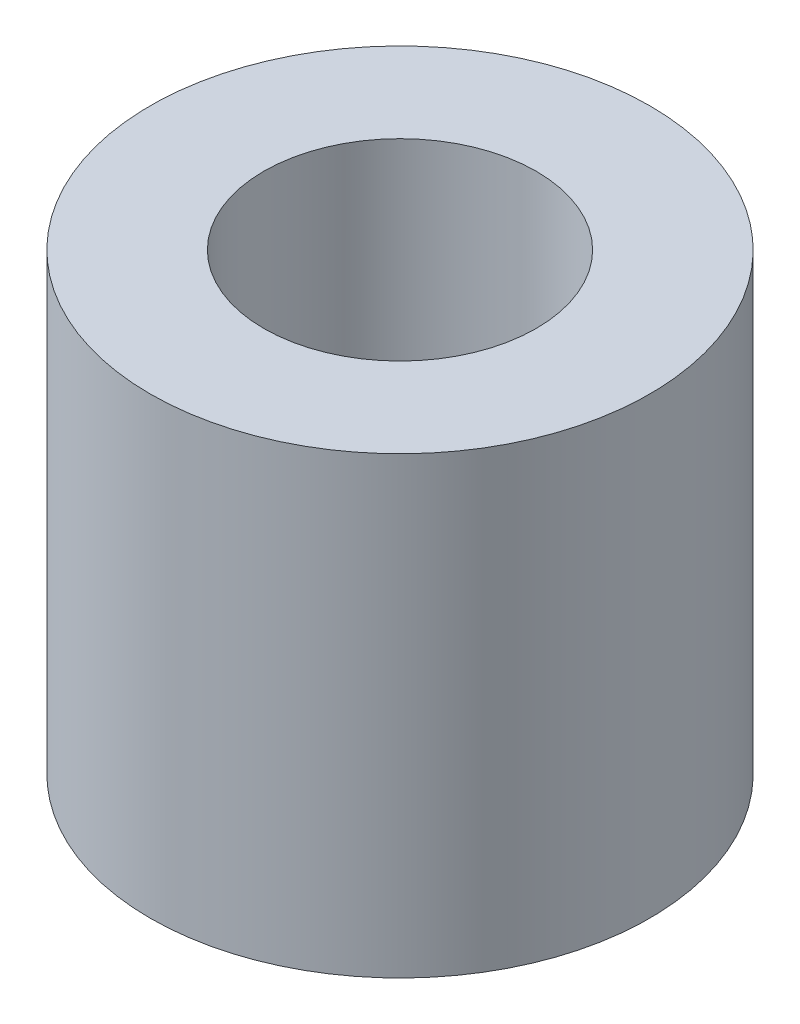
ISO-10303-21;
HEADER;
FILE_DESCRIPTION(('STEP AP214'),'2;1');
FILE_NAME('part.step','',(''),(''),'','','');
FILE_SCHEMA(('AUTOMOTIVE_DESIGN { 1 0 10303 214 1 1 1 1 }'));
ENDSEC;
DATA;
#1=APPLICATION_CONTEXT('core data for automotive mechanical design processes');
#2=APPLICATION_PROTOCOL_DEFINITION('international standard','automotive_design',2000,#1);
#3=PRODUCT_CONTEXT('',#1,'mechanical');
#4=PRODUCT('Part','Part','',(#3));
#5=PRODUCT_RELATED_PRODUCT_CATEGORY('part','',(#4));
#6=PRODUCT_DEFINITION_FORMATION('','',#4);
#7=PRODUCT_DEFINITION_CONTEXT('part definition',#1,'design');
#8=PRODUCT_DEFINITION('design','',#6,#7);
#9=PRODUCT_DEFINITION_SHAPE('','',#8);
#10=(LENGTH_UNIT() NAMED_UNIT(*) SI_UNIT(.MILLI.,.METRE.));
#11=(NAMED_UNIT(*) PLANE_ANGLE_UNIT() SI_UNIT($,.RADIAN.));
#12=(NAMED_UNIT(*) SI_UNIT($,.STERADIAN.) SOLID_ANGLE_UNIT());
#13=UNCERTAINTY_MEASURE_WITH_UNIT(LENGTH_MEASURE(1.E-05),#10,'distance_accuracy_value','');
#14=(GEOMETRIC_REPRESENTATION_CONTEXT(3) GLOBAL_UNCERTAINTY_ASSIGNED_CONTEXT((#13)) GLOBAL_UNIT_ASSIGNED_CONTEXT((#10,
#11,#12)) REPRESENTATION_CONTEXT('',''));
#15=CARTESIAN_POINT('',(0.,0.,0.));
#16=DIRECTION('',(0.,0.,1.));
#17=DIRECTION('',(1.,0.,0.));
#18=AXIS2_PLACEMENT_3D('',#15,#16,#17);
#19=CARTESIAN_POINT('',(0.,5.,0.));
#20=DIRECTION('',(0.,-1.,0.));
#21=DIRECTION('',(0.,0.,-1.));
#22=AXIS2_PLACEMENT_3D('',#19,#20,#21);
#23=CYLINDRICAL_SURFACE('',#22,2.75);
#24=CARTESIAN_POINT('',(0.,5.,0.));
#25=DIRECTION('',(0.,1.,0.));
#26=DIRECTION('',(0.,0.,1.));
#27=AXIS2_PLACEMENT_3D('',#24,#25,#26);
#28=CIRCLE('',#27,2.75);
#29=CARTESIAN_POINT('',(0.,5.,2.75));
#30=VERTEX_POINT('',#29);
#31=EDGE_CURVE('E10',#30,#30,#28,.T.);
#32=ORIENTED_EDGE('',*,*,#31,.F.);
#33=EDGE_LOOP('',(#32));
#34=FACE_BOUND('',#33,.T.);
#35=CARTESIAN_POINT('',(0.,0.,0.));
#36=DIRECTION('',(0.,1.,0.));
#37=DIRECTION('',(0.,0.,1.));
#38=AXIS2_PLACEMENT_3D('',#35,#36,#37);
#39=CIRCLE('',#38,2.75);
#40=CARTESIAN_POINT('',(0.,0.,2.75));
#41=VERTEX_POINT('',#40);
#42=EDGE_CURVE('E57',#41,#41,#39,.T.);
#43=ORIENTED_EDGE('',*,*,#42,.T.);
#44=EDGE_LOOP('',(#43));
#45=FACE_BOUND('',#44,.T.);
#46=ADVANCED_FACE('F50',(#34,#45),#23,.T.);
#47=CARTESIAN_POINT('',(0.,5.,0.));
#48=DIRECTION('',(0.,1.,0.));
#49=DIRECTION('',(0.,0.,1.));
#50=AXIS2_PLACEMENT_3D('',#47,#48,#49);
#51=PLANE('',#50);
#52=CARTESIAN_POINT('',(0.,5.,0.));
#53=DIRECTION('',(0.,1.,0.));
#54=DIRECTION('',(0.,0.,1.));
#55=AXIS2_PLACEMENT_3D('',#52,#53,#54);
#56=CIRCLE('',#55,1.5);
#57=CARTESIAN_POINT('',(0.,5.,1.5));
#58=VERTEX_POINT('',#57);
#59=EDGE_CURVE('E79',#58,#58,#56,.T.);
#60=ORIENTED_EDGE('',*,*,#59,.F.);
#61=EDGE_LOOP('',(#60));
#62=FACE_BOUND('',#61,.T.);
#63=ORIENTED_EDGE('',*,*,#31,.T.);
#64=EDGE_LOOP('',(#63));
#65=FACE_BOUND('',#64,.T.);
#66=ADVANCED_FACE('F85',(#62,#65),#51,.T.);
#67=CARTESIAN_POINT('',(0.,0.,0.));
#68=DIRECTION('',(0.,1.,0.));
#69=DIRECTION('',(0.,0.,1.));
#70=AXIS2_PLACEMENT_3D('',#67,#68,#69);
#71=PLANE('',#70);
#72=CARTESIAN_POINT('',(0.,0.,1.5));
#73=CARTESIAN_POINT('',(0.0247347685201413,0.,1.50000191731977));
#74=CARTESIAN_POINT('',(0.0494707785274392,0.,1.49941047911439));
#75=CARTESIAN_POINT('',(0.098711285107914,0.,1.49702973717077));
#76=CARTESIAN_POINT('',(0.123216190082735,0.,1.49524884881535));
#77=CARTESIAN_POINT('',(0.171994793238844,0.,1.49048966041373));
#78=CARTESIAN_POINT('',(0.196269036682548,0.,1.48751696987769));
#79=CARTESIAN_POINT('',(0.24458604299877,0.,1.4803776814201));
#80=CARTESIAN_POINT('',(0.268629201508579,0.,1.47621376215505));
#81=CARTESIAN_POINT('',(0.316484279183972,0.,1.46669479873131));
#82=CARTESIAN_POINT('',(0.34029614420105,0.,1.46133948234814));
#83=CARTESIAN_POINT('',(0.387689162550758,0.,1.44944085464064));
#84=CARTESIAN_POINT('',(0.411269522479191,0.,1.44289438479575));
#85=CARTESIAN_POINT('',(0.45820019306473,0.,1.4286158629683));
#86=CARTESIAN_POINT('',(0.48154870748097,0.,1.4208779118391));
#87=CARTESIAN_POINT('',(0.528017236187283,0.,1.4042208104248));
#88=CARTESIAN_POINT('',(0.551134233991362,0.,1.3952932559666));
#89=CARTESIAN_POINT('',(0.596863360533465,0.,1.37636715379741));
#90=CARTESIAN_POINT('',(0.619476529112157,0.,1.36637111919517));
#91=CARTESIAN_POINT('',(0.664034064580766,0.,1.34535395524992));
#92=CARTESIAN_POINT('',(0.685981934198623,0.,1.334340260405));
#93=CARTESIAN_POINT('',(0.729210117766866,0.,1.31129212983662));
#94=CARTESIAN_POINT('',(0.750492963164574,0.,1.29926244372853));
#95=CARTESIAN_POINT('',(0.792392002461653,0.,1.27418461850155));
#96=CARTESIAN_POINT('',(0.813009449986701,0.,1.26113857441527));
#97=CARTESIAN_POINT('',(0.853579049090763,0.,1.23403079687989));
#98=CARTESIAN_POINT('',(0.873530892242238,0.,1.21996860186604));
#99=CARTESIAN_POINT('',(0.912770987715104,0.,1.19083115451225));
#100=CARTESIAN_POINT('',(0.932057129929984,0.,1.17575306119582));
#101=CARTESIAN_POINT('',(0.969967308363523,0.,1.14458573744709));
#102=CARTESIAN_POINT('',(0.988587248641817,0.,1.12849152738397));
#103=CARTESIAN_POINT('',(1.02516839349347,0.,1.09529566932262));
#104=CARTESIAN_POINT('',(1.04312341285185,0.,1.07818721107138));
#105=CARTESIAN_POINT('',(1.07814252919732,0.,1.04318750384704));
#106=CARTESIAN_POINT('',(1.09520921716559,0.,1.02529884784119));
#107=CARTESIAN_POINT('',(1.12833220882839,0.,0.988830206366575));
#108=CARTESIAN_POINT('',(1.14439459506974,0.,0.970255750427554));
#109=CARTESIAN_POINT('',(1.17551206025698,0.,0.932419313632704));
#110=CARTESIAN_POINT('',(1.19057129531388,0.,0.913160751866547));
#111=CARTESIAN_POINT('',(1.21968410022328,0.,0.873957802530462));
#112=CARTESIAN_POINT('',(1.23373963003812,0.,0.854014870805388));
#113=CARTESIAN_POINT('',(1.26084735271721,0.,0.813445234315613));
#114=CARTESIAN_POINT('',(1.27389908400013,0.,0.792818221152548));
#115=CARTESIAN_POINT('',(1.29900178729553,0.,0.750882196087141));
#116=CARTESIAN_POINT('',(1.31104972262614,0.,0.729571366964568));
#117=CARTESIAN_POINT('',(1.33414694196362,0.,0.686268917104572));
#118=CARTESIAN_POINT('',(1.3451905361943,0.,0.664274263238161));
#119=CARTESIAN_POINT('',(1.366283602339,0.,0.619606291382987));
#120=CARTESIAN_POINT('',(1.37632475368795,0.,0.596929048519586));
#121=CARTESIAN_POINT('',(1.39528439042208,0.,0.551192299717973));
#122=CARTESIAN_POINT('',(1.40420626184728,0.,0.528134197843492));
#123=CARTESIAN_POINT('',(1.42085197101,0.,0.48176594626997));
#124=CARTESIAN_POINT('',(1.4285835443475,0.,0.45845857750042));
#125=CARTESIAN_POINT('',(1.44285295603568,0.,0.411594129577311));
#126=CARTESIAN_POINT('',(1.44939594256123,0.,0.388038618775887));
#127=CARTESIAN_POINT('',(1.46129034794048,0.,0.340678828161911));
#128=CARTESIAN_POINT('',(1.46664413469096,0.,0.316875143329508));
#129=CARTESIAN_POINT('',(1.47616307710539,0.,0.269020010176691));
#130=CARTESIAN_POINT('',(1.48032768830486,0.,0.244968453572863));
#131=CARTESIAN_POINT('',(1.48747134007842,0.,0.196618229681348));
#132=CARTESIAN_POINT('',(1.49044687970421,0.,0.172319045588923));
#133=CARTESIAN_POINT('',(1.49521479776578,0.,0.123473875281526));
#134=CARTESIAN_POINT('',(1.49700075880558,0.,0.0989272642038461));
#135=CARTESIAN_POINT('',(1.49939451810825,0.,0.0495874722967185));
#136=CARTESIAN_POINT('',(1.49999312718684,0.,0.024793849498333));
#137=CARTESIAN_POINT('',(1.50000685149272,0.,-0.0247169354649043));
#138=CARTESIAN_POINT('',(1.49942563232501,0.,-0.0494340962254271));
#139=CARTESIAN_POINT('',(1.49705990065965,0.,-0.0986428119291011));
#140=CARTESIAN_POINT('',(1.49528359914014,0.,-0.123134757914364));
#141=CARTESIAN_POINT('',(1.49053256875271,0.,-0.171892529595646));
#142=CARTESIAN_POINT('',(1.48756319636057,0.,-0.196158876444453));
#143=CARTESIAN_POINT('',(1.48042838681359,0.,-0.244465409533205));
#144=CARTESIAN_POINT('',(1.47626536499919,0.,-0.268505952238039));
#145=CARTESIAN_POINT('',(1.46674635445583,0.,-0.316361071839167));
#146=CARTESIAN_POINT('',(1.46138982126901,0.,-0.340175540418757));
#147=CARTESIAN_POINT('',(1.44948686529556,0.,-0.387579079844785));
#148=CARTESIAN_POINT('',(1.44293701028185,0.,-0.411167288401632));
#149=CARTESIAN_POINT('',(1.42864975476394,0.,-0.458118944759688));
#150=CARTESIAN_POINT('',(1.42090618623434,0.,-0.481480514027641));
#151=CARTESIAN_POINT('',(1.40423621054064,0.,-0.527980589935181));
#152=CARTESIAN_POINT('',(1.39530114454308,0.,-0.551115988352242));
#153=CARTESIAN_POINT('',(1.37636686701957,0.,-0.596863241282803));
#154=CARTESIAN_POINT('',(1.36637104260847,0.,-0.619476497265175));
#155=CARTESIAN_POINT('',(1.34535403131567,0.,-0.664034096211195));
#156=CARTESIAN_POINT('',(1.33434028074329,0.,-0.685981942655941));
#157=CARTESIAN_POINT('',(1.31129210958854,0.,-0.729210109347193));
#158=CARTESIAN_POINT('',(1.29926243830797,0.,-0.750492960910625));
#159=CARTESIAN_POINT('',(1.2741846239111,0.,-0.792392004711189));
#160=CARTESIAN_POINT('',(1.26113857586517,0.,-0.813009450589703));
#161=CARTESIAN_POINT('',(1.2340307954292,0.,-0.853579048487609));
#162=CARTESIAN_POINT('',(1.21996860147669,0.,-0.873530892080417));
#163=CARTESIAN_POINT('',(1.19083115490263,0.,-0.912770987877514));
#164=CARTESIAN_POINT('',(1.17575306130067,0.,-0.932057129973657));
#165=CARTESIAN_POINT('',(1.14458573734158,0.,-0.969967308319709));
#166=CARTESIAN_POINT('',(1.12849152735558,0.,-0.988587248630059));
#167=CARTESIAN_POINT('',(1.09529566935118,0.,-1.02516839350537));
#168=CARTESIAN_POINT('',(1.07818721107901,0.,-1.04312341285504));
#169=CARTESIAN_POINT('',(1.04318750383942,0.,-1.07814252919415));
#170=CARTESIAN_POINT('',(1.02529884783916,0.,-1.09520921716474));
#171=CARTESIAN_POINT('',(0.988830206368606,0.,-1.12833220882921));
#172=CARTESIAN_POINT('',(0.970255750428107,0.,-1.14439459506996));
#173=CARTESIAN_POINT('',(0.932419313632181,0.,-1.17551206025675));
#174=CARTESIAN_POINT('',(0.913160751866419,0.,-1.1905712953138));
#175=CARTESIAN_POINT('',(0.873957802530625,0.,-1.21968410022332));
#176=CARTESIAN_POINT('',(0.854014870805445,0.,-1.23373963003812));
#177=CARTESIAN_POINT('',(0.813445234315594,0.,-1.26084735271717));
#178=CARTESIAN_POINT('',(0.792818221152557,0.,-1.2738990840001));
#179=CARTESIAN_POINT('',(0.750882196087169,0.,-1.29900178729551));
#180=CARTESIAN_POINT('',(0.729571366964587,0.,-1.31104972262613));
#181=CARTESIAN_POINT('',(0.686268917104581,0.,-1.33414694196361));
#182=CARTESIAN_POINT('',(0.66427426323817,0.,-1.34519053619428));
#183=CARTESIAN_POINT('',(0.619606291382993,0.,-1.366283602339));
#184=CARTESIAN_POINT('',(0.59692904851959,0.,-1.37632475368794));
#185=CARTESIAN_POINT('',(0.551192299717976,0.,-1.39528439042208));
#186=CARTESIAN_POINT('',(0.5281341978435,0.,-1.40420626184728));
#187=CARTESIAN_POINT('',(0.481765946269986,0.,-1.42085197101));
#188=CARTESIAN_POINT('',(0.458458577500438,0.,-1.4285835443475));
#189=CARTESIAN_POINT('',(0.411594129577334,0.,-1.44285295603568));
#190=CARTESIAN_POINT('',(0.388038618775911,0.,-1.44939594256124));
#191=CARTESIAN_POINT('',(0.340678828161938,0.,-1.46129034794048));
#192=CARTESIAN_POINT('',(0.316875143329535,0.,-1.46664413469097));
#193=CARTESIAN_POINT('',(0.269020010176719,0.,-1.47616307710539));
#194=CARTESIAN_POINT('',(0.24496845357289,0.,-1.48032768830486));
#195=CARTESIAN_POINT('',(0.196618229681372,0.,-1.48747134007842));
#196=CARTESIAN_POINT('',(0.172319045588946,0.,-1.49044687970421));
#197=CARTESIAN_POINT('',(0.123473875281544,0.,-1.49521479776578));
#198=CARTESIAN_POINT('',(0.0989272642038614,0.,-1.49700075880558));
#199=CARTESIAN_POINT('',(0.0495874722967268,0.,-1.49939451810825));
#200=CARTESIAN_POINT('',(0.0247938494983373,0.,-1.49999312718684));
#201=CARTESIAN_POINT('',(-0.0247169354648866,0.,-1.50000685149272));
#202=CARTESIAN_POINT('',(-0.0494340962253918,0.,-1.49942563232501));
#203=CARTESIAN_POINT('',(-0.0986428119290357,0.,-1.49705990065965));
#204=CARTESIAN_POINT('',(-0.123134757914286,0.,-1.49528359914014));
#205=CARTESIAN_POINT('',(-0.171892529595547,0.,-1.49053256875271));
#206=CARTESIAN_POINT('',(-0.196158876444348,0.,-1.48756319636057));
#207=CARTESIAN_POINT('',(-0.244465409533089,0.,-1.48042838681359));
#208=CARTESIAN_POINT('',(-0.268505952237921,0.,-1.47626536499919));
#209=CARTESIAN_POINT('',(-0.316361071839049,0.,-1.46674635445583));
#210=CARTESIAN_POINT('',(-0.340175540418641,0.,-1.46138982126901));
#211=CARTESIAN_POINT('',(-0.387579079844679,0.,-1.44948686529556));
#212=CARTESIAN_POINT('',(-0.411167288401534,0.,-1.44293701028185));
#213=CARTESIAN_POINT('',(-0.458118944759609,0.,-1.42864975476394));
#214=CARTESIAN_POINT('',(-0.481480514027575,0.,-1.42090618623434));
#215=CARTESIAN_POINT('',(-0.527980589935146,0.,-1.40423621054064));
#216=CARTESIAN_POINT('',(-0.551115988352224,0.,-1.39530114454308));
#217=CARTESIAN_POINT('',(-0.596863241282783,0.,-1.37636686701959));
#218=CARTESIAN_POINT('',(-0.619476497265135,0.,-1.3663710426085));
#219=CARTESIAN_POINT('',(-0.664034096211121,0.,-1.34535403131573));
#220=CARTESIAN_POINT('',(-0.685981942655852,0.,-1.33434028074336));
#221=CARTESIAN_POINT('',(-0.729210109347081,0.,-1.31129210958863));
#222=CARTESIAN_POINT('',(-0.750492960910505,0.,-1.29926243830807));
#223=CARTESIAN_POINT('',(-0.792392004711057,0.,-1.2741846239112));
#224=CARTESIAN_POINT('',(-0.813009450589568,0.,-1.26113857586528));
#225=CARTESIAN_POINT('',(-0.853579048487474,0.,-1.2340307954293));
#226=CARTESIAN_POINT('',(-0.873530892080284,0.,-1.21996860147679));
#227=CARTESIAN_POINT('',(-0.912770987877394,0.,-1.19083115490272));
#228=CARTESIAN_POINT('',(-0.932057129973545,0.,-1.17575306130075));
#229=CARTESIAN_POINT('',(-0.969967308319619,0.,-1.14458573734165));
#230=CARTESIAN_POINT('',(-0.988587248629984,0.,-1.12849152735564));
#231=CARTESIAN_POINT('',(-1.02516839350533,0.,-1.09529566935121));
#232=CARTESIAN_POINT('',(-1.04312341285502,0.,-1.07818721107903));
#233=CARTESIAN_POINT('',(-1.07814252919416,0.,-1.04318750383942));
#234=CARTESIAN_POINT('',(-1.09520921716476,0.,-1.02529884783915));
#235=CARTESIAN_POINT('',(-1.12833220882925,0.,-0.988830206368587));
#236=CARTESIAN_POINT('',(-1.14439459507,0.,-0.970255750428083));
#237=CARTESIAN_POINT('',(-1.1755120602568,0.,-0.932419313632152));
#238=CARTESIAN_POINT('',(-1.19057129531386,0.,-0.913160751866387));
#239=CARTESIAN_POINT('',(-1.21968410022339,0.,-0.873957802530589));
#240=CARTESIAN_POINT('',(-1.23373963003819,0.,-0.854014870805409));
#241=CARTESIAN_POINT('',(-1.26084735271724,0.,-0.813445234315558));
#242=CARTESIAN_POINT('',(-1.27389908400017,0.,-0.792818221152521));
#243=CARTESIAN_POINT('',(-1.29900178729558,0.,-0.750882196087137));
#244=CARTESIAN_POINT('',(-1.31104972262618,0.,-0.729571366964557));
#245=CARTESIAN_POINT('',(-1.33414694196365,0.,-0.686268917104558));
#246=CARTESIAN_POINT('',(-1.34519053619432,0.,-0.664274263238151));
#247=CARTESIAN_POINT('',(-1.36628360233902,0.,-0.619606291382983));
#248=CARTESIAN_POINT('',(-1.37632475368795,0.,-0.596929048519585));
#249=CARTESIAN_POINT('',(-1.39528439042208,0.,-0.551192299717958));
#250=CARTESIAN_POINT('',(-1.40420626184728,0.,-0.528134197843463));
#251=CARTESIAN_POINT('',(-1.42085197101,0.,-0.481765946269916));
#252=CARTESIAN_POINT('',(-1.42858354434749,0.,-0.458458577500356));
#253=CARTESIAN_POINT('',(-1.44285295603568,0.,-0.41159412957723));
#254=CARTESIAN_POINT('',(-1.44939594256123,0.,-0.3880386187758));
#255=CARTESIAN_POINT('',(-1.46129034794048,0.,-0.340678828161815));
#256=CARTESIAN_POINT('',(-1.46664413469096,0.,-0.31687514332941));
#257=CARTESIAN_POINT('',(-1.47616307710539,0.,-0.269020010176593));
#258=CARTESIAN_POINT('',(-1.48032768830486,0.,-0.244968453572767));
#259=CARTESIAN_POINT('',(-1.48747134007842,0.,-0.196618229681261));
#260=CARTESIAN_POINT('',(-1.49044687970421,0.,-0.172319045588842));
#261=CARTESIAN_POINT('',(-1.49521479776578,0.,-0.123473875281462));
#262=CARTESIAN_POINT('',(-1.49700075880558,0.,-0.0989272642037922));
#263=CARTESIAN_POINT('',(-1.49939451810825,0.,-0.0495874722966896));
#264=CARTESIAN_POINT('',(-1.49999312718684,0.,-0.0247938494983187));
#265=CARTESIAN_POINT('',(-1.50000685149272,0.,0.0247169354648974));
#266=CARTESIAN_POINT('',(-1.49942563232501,0.,0.0494340962254135));
#267=CARTESIAN_POINT('',(-1.49705990065965,0.,0.0986428119290759));
#268=CARTESIAN_POINT('',(-1.49528359914014,0.,0.123134757914334));
#269=CARTESIAN_POINT('',(-1.49053256875271,0.,0.171892529595608));
#270=CARTESIAN_POINT('',(-1.48756319636057,0.,0.196158876444413));
#271=CARTESIAN_POINT('',(-1.48042838681359,0.,0.24446540953316));
#272=CARTESIAN_POINT('',(-1.47626536499919,0.,0.268505952237994));
#273=CARTESIAN_POINT('',(-1.46674635445583,0.,0.316361071839122));
#274=CARTESIAN_POINT('',(-1.46138982126901,0.,0.340175540418712));
#275=CARTESIAN_POINT('',(-1.44948686529556,0.,0.387579079844745));
#276=CARTESIAN_POINT('',(-1.44293701028185,0.,0.411167288401595));
#277=CARTESIAN_POINT('',(-1.42864975476394,0.,0.458118944759658));
#278=CARTESIAN_POINT('',(-1.42090618623434,0.,0.481480514027616));
#279=CARTESIAN_POINT('',(-1.40423621054064,0.,0.527980589935168));
#280=CARTESIAN_POINT('',(-1.39530114454308,0.,0.551115988352235));
#281=CARTESIAN_POINT('',(-1.37636686701957,0.,0.596863241282799));
#282=CARTESIAN_POINT('',(-1.36637104260847,0.,0.619476497265167));
#283=CARTESIAN_POINT('',(-1.34535403131569,0.,0.664034096211177));
#284=CARTESIAN_POINT('',(-1.33434028074331,0.,0.685981942655918));
#285=CARTESIAN_POINT('',(-1.31129210958857,0.,0.72921010934717));
#286=CARTESIAN_POINT('',(-1.29926243830801,0.,0.750492960910608));
#287=CARTESIAN_POINT('',(-1.27418462391113,0.,0.792392004711148));
#288=CARTESIAN_POINT('',(-1.26113857586519,0.,0.813009450589632));
#289=CARTESIAN_POINT('',(-1.23403079542924,0.,0.853579048487616));
#290=CARTESIAN_POINT('',(-1.21996860147678,0.,0.87353089208053));
#291=CARTESIAN_POINT('',(-1.1908311549026,0.,0.91277098787734));
#292=CARTESIAN_POINT('',(-1.17575306130047,0.,0.932057129973087));
#293=CARTESIAN_POINT('',(-1.14458573734183,0.,0.969967308320233));
#294=CARTESIAN_POINT('',(-1.12849152735645,0.,0.988587248632084));
#295=CARTESIAN_POINT('',(-1.09529566935033,0.,1.0251683935033));
#296=CARTESIAN_POINT('',(-1.0781872110758,0.,1.04312341284732));
#297=CARTESIAN_POINT('',(-1.04318750384262,0.,1.07814252920184));
#298=CARTESIAN_POINT('',(-1.02529884785109,0.,1.0952092171934));
#299=CARTESIAN_POINT('',(-0.988830206356722,0.,1.12833220880078));
#300=CARTESIAN_POINT('',(-0.970255750383947,0.,1.14439459496413));
#301=CARTESIAN_POINT('',(-0.932419313676091,0.,1.17551206036216));
#302=CARTESIAN_POINT('',(-0.913160752029996,0.,1.19057129570623));
#303=CARTESIAN_POINT('',(-0.873957802367308,0.,1.21968409983174));
#304=CARTESIAN_POINT('',(-0.854014870196705,0.,1.23373962857825));
#305=CARTESIAN_POINT('',(-0.813445234924539,0.,1.26084735417778));
#306=CARTESIAN_POINT('',(-0.792818223425575,0.,1.27389908945181));
#307=CARTESIAN_POINT('',(-0.750882193807439,0.,1.29900178182794));
#308=CARTESIAN_POINT('',(-0.729571358444985,0.,1.3110497021929));
#309=CARTESIAN_POINT('',(-0.686268925669725,0.,1.33414696250625));
#310=CARTESIAN_POINT('',(-0.664274295286334,0.,1.34519061305836));
#311=CARTESIAN_POINT('',(-0.619606259087724,0.,1.36628352488237));
#312=CARTESIAN_POINT('',(-0.596928927538332,0.,1.37632446352769));
#313=CARTESIAN_POINT('',(-0.551174025918387,0.,1.39529230514219));
#314=CARTESIAN_POINT('',(-0.528097495867619,0.,1.40422171623575));
#315=CARTESIAN_POINT('',(-0.481697648144694,0.,1.42088034614802));
#316=CARTESIAN_POINT('',(-0.45837720430135,0.,1.42861755810062));
#317=CARTESIAN_POINT('',(-0.411491739369845,0.,1.4428957315904));
#318=CARTESIAN_POINT('',(-0.387928369299279,0.,1.44944211148131));
#319=CARTESIAN_POINT('',(-0.340558037167847,0.,1.46134087072968));
#320=CARTESIAN_POINT('',(-0.316751739183575,0.,1.4666958924649));
#321=CARTESIAN_POINT('',(-0.268896578889262,0.,1.47621484357386));
#322=CARTESIAN_POINT('',(-0.244847662433289,0.,1.48037850069419));
#323=CARTESIAN_POINT('',(-0.19650787183171,0.,1.48751780205908));
#324=CARTESIAN_POINT('',(-0.172216519719711,0.,1.49049020834572));
#325=CARTESIAN_POINT('',(-0.123392423045567,0.,1.49524939885631));
#326=CARTESIAN_POINT('',(-0.0988590794768771,0.,1.49703001297542));
#327=CARTESIAN_POINT('',(-0.0495503373854331,0.,1.49941074318796));
#328=CARTESIAN_POINT('',(-0.0247745043790469,0.,1.50000189650473));
#329=CARTESIAN_POINT('',(0.,0.,1.5));
#330=B_SPLINE_CURVE_WITH_KNOTS('',3,(#72,#73,#74,#75,#76,#77,#78,#79,#80,#81,#82,#83,#84,#85,
#86,#87,#88,#89,#90,#91,#92,#93,#94,#95,#96,#97,#98,#99,#100,#101,#102,#103,#104,#105,#106,#107,
#108,#109,#110,#111,#112,#113,#114,#115,#116,#117,#118,#119,#120,#121,#122,#123,#124,#125,#126,
#127,#128,#129,#130,#131,#132,#133,#134,#135,#136,#137,#138,#139,#140,#141,#142,#143,#144,#145,
#146,#147,#148,#149,#150,#151,#152,#153,#154,#155,#156,#157,#158,#159,#160,#161,#162,#163,#164,
#165,#166,#167,#168,#169,#170,#171,#172,#173,#174,#175,#176,#177,#178,#179,#180,#181,#182,#183,
#184,#185,#186,#187,#188,#189,#190,#191,#192,#193,#194,#195,#196,#197,#198,#199,#200,#201,#202,
#203,#204,#205,#206,#207,#208,#209,#210,#211,#212,#213,#214,#215,#216,#217,#218,#219,#220,#221,
#222,#223,#224,#225,#226,#227,#228,#229,#230,#231,#232,#233,#234,#235,#236,#237,#238,#239,#240,
#241,#242,#243,#244,#245,#246,#247,#248,#249,#250,#251,#252,#253,#254,#255,#256,#257,#258,#259,
#260,#261,#262,#263,#264,#265,#266,#267,#268,#269,#270,#271,#272,#273,#274,#275,#276,#277,#278,
#279,#280,#281,#282,#283,#284,#285,#286,#287,#288,#289,#290,#291,#292,#293,#294,#295,#296,#297,
#298,#299,#300,#301,#302,#303,#304,#305,#306,#307,#308,#309,#310,#311,#312,#313,#314,#315,#316,
#317,#318,#319,#320,#321,#322,#323,#324,#325,#326,#327,#328,#329),.UNSPECIFIED.,.F.,.F.,(4,2,2,
2,2,2,2,2,2,2,2,2,2,2,2,2,2,2,2,2,2,2,2,2,2,2,2,2,2,2,2,2,2,2,2,2,2,2,2,2,2,2,2,2,2,2,2,2,2,2,2,
2,2,2,2,2,2,2,2,2,2,2,2,2,2,2,2,2,2,2,2,2,2,2,2,2,2,2,2,2,2,2,2,2,2,2,2,2,2,2,2,2,2,2,2,2,2,2,2,
2,2,2,2,2,2,2,2,2,2,2,2,2,2,2,2,2,2,2,2,2,2,2,2,2,2,2,2,2,4),(0.,0.0741989708048554,
0.147878466158453,0.221215167441637,0.294388239176489,0.367578047562669,0.440964835396546,
0.51472740149901,0.589041832398688,0.663185166528956,0.736824221437525,0.810136292194152,
0.883301050981045,0.95649925476356,1.02991141346054,1.10371646715634,1.17809052013483,
1.2522338542651,1.32587290917367,1.39918497993029,1.47234973871718,1.5455479424997,
1.61896010119669,1.69276515489248,1.76713920787097,1.84128254200127,1.91492159690986,
1.9882336676665,2.0613984264534,2.13459663023591,2.20800878893288,2.28181384262865,
2.35618789560712,2.43033122973746,2.50397028464608,2.57728235540273,2.65044711418964,
2.72364531797214,2.7970574766691,2.87086253036484,2.94523658334327,3.01937991747357,
3.09301897238217,3.16633104313881,3.23949580192571,3.31269400570822,3.38610616440519,
3.45991121810095,3.53428527107941,3.60842860520966,3.68206766011822,3.75537973087484,
3.82854448966173,3.90174269344425,3.97515485214124,4.04895990583704,4.12333395881555,
4.19747729294583,4.27111634785442,4.34442841861105,4.41759317739795,4.49079138118046,
4.56420353987744,4.63800859357321,4.71238264655169,4.78652598068198,4.86016503559056,
4.93347710634719,5.00664186513409,5.0798400689166,5.15325222761358,5.22705728130936,
5.30143133428783,5.37557466841806,5.44921372332661,5.52252579408322,5.5956905528701,
5.66888875665262,5.74230091534962,5.81610596904544,5.89048002202397,5.96462335615426,
6.03826241106284,6.11157448181948,6.18473924060637,6.25793744438888,6.33134960308586,
6.40515465678164,6.47952870976012,6.55367204389046,6.62731109879908,6.70062316955574,
6.77378792834264,6.84698613212515,6.9203982908221,6.99420334451784,7.06857739749627,
7.14272073162658,7.21635978653519,7.28967185729184,7.36283661607874,7.43603481986125,
7.50944697855821,7.58325203225396,7.65762608523241,7.7317694193627,7.80540847427128,
7.87872054502791,7.95188530381481,8.02508350759732,8.0984956662943,8.17230071999007,
8.24667477296855,8.32081810709883,8.39445716200741,8.46776923276404,8.54093399155093,
8.61413219533344,8.68754435403043,8.76134940772621,8.8357234607047,8.90992652587293,
8.98360814499246,9.05694563133221,9.13011879991218,9.20330867686438,9.27669616467645,
9.35046071196916,9.42477903607617),.UNSPECIFIED.);
#331=CARTESIAN_POINT('',(0.,0.,1.5));
#332=VERTEX_POINT('',#331);
#333=EDGE_CURVE('E61',#332,#332,#330,.T.);
#334=ORIENTED_EDGE('',*,*,#333,.T.);
#335=EDGE_LOOP('',(#334));
#336=FACE_BOUND('',#335,.T.);
#337=ORIENTED_EDGE('',*,*,#42,.F.);
#338=EDGE_LOOP('',(#337));
#339=FACE_BOUND('',#338,.T.);
#340=ADVANCED_FACE('F75',(#336,#339),#71,.F.);
#341=CARTESIAN_POINT('',(0.,-1.2E-05,0.));
#342=DIRECTION('',(0.,1.,0.));
#343=DIRECTION('',(0.,0.,1.));
#344=AXIS2_PLACEMENT_3D('',#341,#342,#343);
#345=CYLINDRICAL_SURFACE('',#344,1.5);
#346=ORIENTED_EDGE('',*,*,#333,.F.);
#347=EDGE_LOOP('',(#346));
#348=FACE_BOUND('',#347,.T.);
#349=ORIENTED_EDGE('',*,*,#59,.T.);
#350=EDGE_LOOP('',(#349));
#351=FACE_BOUND('',#350,.T.);
#352=ADVANCED_FACE('F84',(#348,#351),#345,.F.);
#353=CLOSED_SHELL('',(#46,#66,#340,#352));
#354=MANIFOLD_SOLID_BREP('B2',#353);
#355=ADVANCED_BREP_SHAPE_REPRESENTATION('',(#18,#354),#14);
#356=SHAPE_DEFINITION_REPRESENTATION(#9,#355);
ENDSEC;
END-ISO-10303-21;
